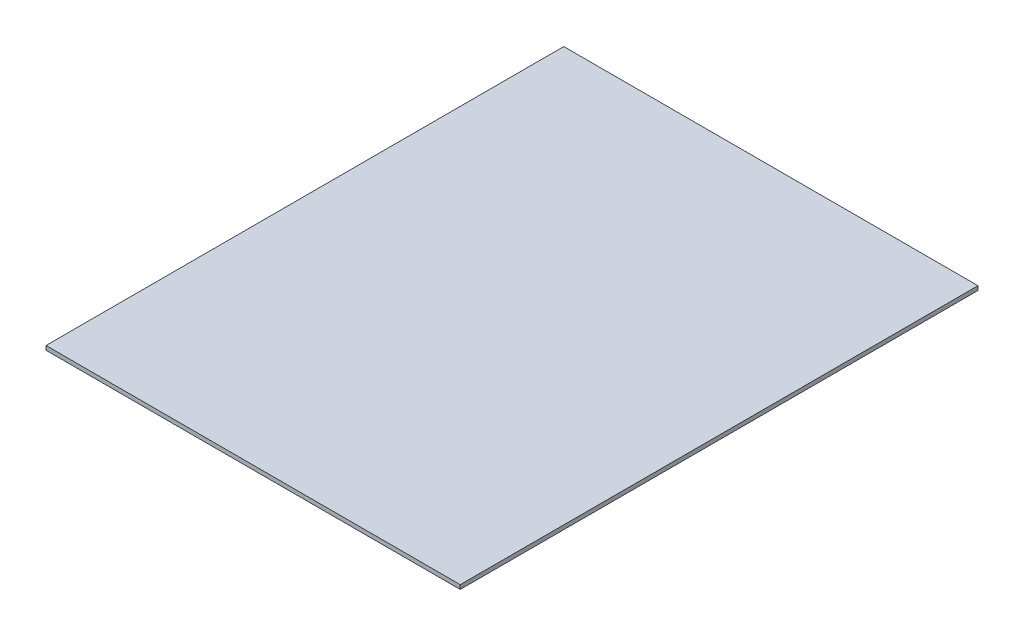
ISO-10303-21;
HEADER;
FILE_DESCRIPTION(('STEP AP214'),'2;1');
FILE_NAME('part.step','',(''),(''),'','','');
FILE_SCHEMA(('AUTOMOTIVE_DESIGN { 1 0 10303 214 1 1 1 1 }'));
ENDSEC;
DATA;
#1=APPLICATION_CONTEXT('core data for automotive mechanical design processes');
#2=APPLICATION_PROTOCOL_DEFINITION('international standard','automotive_design',2000,#1);
#3=PRODUCT_CONTEXT('',#1,'mechanical');
#4=PRODUCT('Part','Part','',(#3));
#5=PRODUCT_RELATED_PRODUCT_CATEGORY('part','',(#4));
#6=PRODUCT_DEFINITION_FORMATION('','',#4);
#7=PRODUCT_DEFINITION_CONTEXT('part definition',#1,'design');
#8=PRODUCT_DEFINITION('design','',#6,#7);
#9=PRODUCT_DEFINITION_SHAPE('','',#8);
#10=(LENGTH_UNIT() NAMED_UNIT(*) SI_UNIT(.MILLI.,.METRE.));
#11=(NAMED_UNIT(*) PLANE_ANGLE_UNIT() SI_UNIT($,.RADIAN.));
#12=(NAMED_UNIT(*) SI_UNIT($,.STERADIAN.) SOLID_ANGLE_UNIT());
#13=UNCERTAINTY_MEASURE_WITH_UNIT(LENGTH_MEASURE(1.E-05),#10,'distance_accuracy_value','');
#14=(GEOMETRIC_REPRESENTATION_CONTEXT(3) GLOBAL_UNCERTAINTY_ASSIGNED_CONTEXT((#13)) GLOBAL_UNIT_ASSIGNED_CONTEXT((#10,
#11,#12)) REPRESENTATION_CONTEXT('',''));
#15=CARTESIAN_POINT('',(0.,0.,0.));
#16=DIRECTION('',(0.,0.,1.));
#17=DIRECTION('',(1.,0.,0.));
#18=AXIS2_PLACEMENT_3D('',#15,#16,#17);
#19=CARTESIAN_POINT('',(2000.,40.,2500.));
#20=DIRECTION('',(-1.,0.,0.));
#21=DIRECTION('',(0.,0.,1.));
#22=AXIS2_PLACEMENT_3D('',#19,#20,#21);
#23=PLANE('',#22);
#24=DIRECTION('',(0.,0.,-1.));
#25=VECTOR('',#24,1.);
#26=CARTESIAN_POINT('',(2000.,0.,2500.));
#27=LINE('',#26,#25);
#28=CARTESIAN_POINT('',(2000.,0.,2500.));
#29=VERTEX_POINT('',#28);
#30=CARTESIAN_POINT('',(2000.,0.,-2500.));
#31=VERTEX_POINT('',#30);
#32=EDGE_CURVE('E107',#29,#31,#27,.T.);
#33=ORIENTED_EDGE('',*,*,#32,.T.);
#34=DIRECTION('',(0.,-1.,0.));
#35=VECTOR('',#34,1.);
#36=CARTESIAN_POINT('',(2000.,40.,-2500.));
#37=LINE('',#36,#35);
#38=CARTESIAN_POINT('',(2000.,40.,-2500.));
#39=VERTEX_POINT('',#38);
#40=EDGE_CURVE('E11',#39,#31,#37,.T.);
#41=ORIENTED_EDGE('',*,*,#40,.F.);
#42=DIRECTION('',(0.,0.,-1.));
#43=VECTOR('',#42,1.);
#44=CARTESIAN_POINT('',(2000.,40.,2500.));
#45=LINE('',#44,#43);
#46=CARTESIAN_POINT('',(2000.,40.,2500.));
#47=VERTEX_POINT('',#46);
#48=EDGE_CURVE('E91',#47,#39,#45,.T.);
#49=ORIENTED_EDGE('',*,*,#48,.F.);
#50=DIRECTION('',(0.,-1.,0.));
#51=VECTOR('',#50,1.);
#52=CARTESIAN_POINT('',(2000.,40.,2500.));
#53=LINE('',#52,#51);
#54=EDGE_CURVE('E103',#47,#29,#53,.T.);
#55=ORIENTED_EDGE('',*,*,#54,.T.);
#56=EDGE_LOOP('',(#33,#41,#49,#55));
#57=FACE_BOUND('',#56,.T.);
#58=ADVANCED_FACE('F39',(#57),#23,.F.);
#59=CARTESIAN_POINT('',(-2000.,40.,-2500.));
#60=DIRECTION('',(0.,0.,1.));
#61=DIRECTION('',(1.,0.,0.));
#62=AXIS2_PLACEMENT_3D('',#59,#60,#61);
#63=PLANE('',#62);
#64=DIRECTION('',(-1.,0.,0.));
#65=VECTOR('',#64,1.);
#66=CARTESIAN_POINT('',(-2000.,0.,-2500.));
#67=LINE('',#66,#65);
#68=CARTESIAN_POINT('',(-2000.,0.,-2500.));
#69=VERTEX_POINT('',#68);
#70=EDGE_CURVE('E96',#31,#69,#67,.T.);
#71=ORIENTED_EDGE('',*,*,#70,.T.);
#72=DIRECTION('',(0.,-1.,0.));
#73=VECTOR('',#72,1.);
#74=CARTESIAN_POINT('',(-2000.,40.,-2500.));
#75=LINE('',#74,#73);
#76=CARTESIAN_POINT('',(-2000.,40.,-2500.));
#77=VERTEX_POINT('',#76);
#78=EDGE_CURVE('E48',#77,#69,#75,.T.);
#79=ORIENTED_EDGE('',*,*,#78,.F.);
#80=DIRECTION('',(-1.,0.,0.));
#81=VECTOR('',#80,1.);
#82=CARTESIAN_POINT('',(-2000.,40.,-2500.));
#83=LINE('',#82,#81);
#84=EDGE_CURVE('E86',#39,#77,#83,.T.);
#85=ORIENTED_EDGE('',*,*,#84,.F.);
#86=ORIENTED_EDGE('',*,*,#40,.T.);
#87=EDGE_LOOP('',(#71,#79,#85,#86));
#88=FACE_BOUND('',#87,.T.);
#89=ADVANCED_FACE('F95',(#88),#63,.F.);
#90=CARTESIAN_POINT('',(-2000.,40.,2500.));
#91=DIRECTION('',(1.,0.,0.));
#92=DIRECTION('',(0.,0.,-1.));
#93=AXIS2_PLACEMENT_3D('',#90,#91,#92);
#94=PLANE('',#93);
#95=DIRECTION('',(0.,0.,1.));
#96=VECTOR('',#95,1.);
#97=CARTESIAN_POINT('',(-2000.,0.,2500.));
#98=LINE('',#97,#96);
#99=CARTESIAN_POINT('',(-2000.,0.,2500.));
#100=VERTEX_POINT('',#99);
#101=EDGE_CURVE('E73',#69,#100,#98,.T.);
#102=ORIENTED_EDGE('',*,*,#101,.T.);
#103=DIRECTION('',(0.,-1.,0.));
#104=VECTOR('',#103,1.);
#105=CARTESIAN_POINT('',(-2000.,40.,2500.));
#106=LINE('',#105,#104);
#107=CARTESIAN_POINT('',(-2000.,40.,2500.));
#108=VERTEX_POINT('',#107);
#109=EDGE_CURVE('E98',#108,#100,#106,.T.);
#110=ORIENTED_EDGE('',*,*,#109,.F.);
#111=DIRECTION('',(0.,0.,1.));
#112=VECTOR('',#111,1.);
#113=CARTESIAN_POINT('',(-2000.,40.,2500.));
#114=LINE('',#113,#112);
#115=EDGE_CURVE('E89',#77,#108,#114,.T.);
#116=ORIENTED_EDGE('',*,*,#115,.F.);
#117=ORIENTED_EDGE('',*,*,#78,.T.);
#118=EDGE_LOOP('',(#102,#110,#116,#117));
#119=FACE_BOUND('',#118,.T.);
#120=ADVANCED_FACE('F99',(#119),#94,.F.);
#121=CARTESIAN_POINT('',(-2000.,40.,2500.));
#122=DIRECTION('',(0.,0.,-1.));
#123=DIRECTION('',(-1.,0.,0.));
#124=AXIS2_PLACEMENT_3D('',#121,#122,#123);
#125=PLANE('',#124);
#126=DIRECTION('',(1.,0.,0.));
#127=VECTOR('',#126,1.);
#128=CARTESIAN_POINT('',(-2000.,0.,2500.));
#129=LINE('',#128,#127);
#130=EDGE_CURVE('E79',#100,#29,#129,.T.);
#131=ORIENTED_EDGE('',*,*,#130,.T.);
#132=ORIENTED_EDGE('',*,*,#54,.F.);
#133=DIRECTION('',(1.,0.,0.));
#134=VECTOR('',#133,1.);
#135=CARTESIAN_POINT('',(-2000.,40.,2500.));
#136=LINE('',#135,#134);
#137=EDGE_CURVE('E56',#108,#47,#136,.T.);
#138=ORIENTED_EDGE('',*,*,#137,.F.);
#139=ORIENTED_EDGE('',*,*,#109,.T.);
#140=EDGE_LOOP('',(#131,#132,#138,#139));
#141=FACE_BOUND('',#140,.T.);
#142=ADVANCED_FACE('F120',(#141),#125,.F.);
#143=CARTESIAN_POINT('',(0.,40.,0.));
#144=DIRECTION('',(0.,-1.,0.));
#145=DIRECTION('',(0.,0.,-1.));
#146=AXIS2_PLACEMENT_3D('',#143,#144,#145);
#147=PLANE('',#146);
#148=ORIENTED_EDGE('',*,*,#48,.T.);
#149=ORIENTED_EDGE('',*,*,#84,.T.);
#150=ORIENTED_EDGE('',*,*,#115,.T.);
#151=ORIENTED_EDGE('',*,*,#137,.T.);
#152=EDGE_LOOP('',(#148,#149,#150,#151));
#153=FACE_BOUND('',#152,.T.);
#154=ADVANCED_FACE('F87',(#153),#147,.F.);
#155=CARTESIAN_POINT('',(0.,0.,0.));
#156=DIRECTION('',(0.,-1.,0.));
#157=DIRECTION('',(0.,0.,-1.));
#158=AXIS2_PLACEMENT_3D('',#155,#156,#157);
#159=PLANE('',#158);
#160=ORIENTED_EDGE('',*,*,#32,.F.);
#161=ORIENTED_EDGE('',*,*,#130,.F.);
#162=ORIENTED_EDGE('',*,*,#101,.F.);
#163=ORIENTED_EDGE('',*,*,#70,.F.);
#164=EDGE_LOOP('',(#160,#161,#162,#163));
#165=FACE_BOUND('',#164,.T.);
#166=ADVANCED_FACE('F123',(#165),#159,.T.);
#167=CLOSED_SHELL('',(#58,#89,#120,#142,#154,#166));
#168=MANIFOLD_SOLID_BREP('B2',#167);
#169=ADVANCED_BREP_SHAPE_REPRESENTATION('',(#18,#168),#14);
#170=SHAPE_DEFINITION_REPRESENTATION(#9,#169);
ENDSEC;
END-ISO-10303-21;
